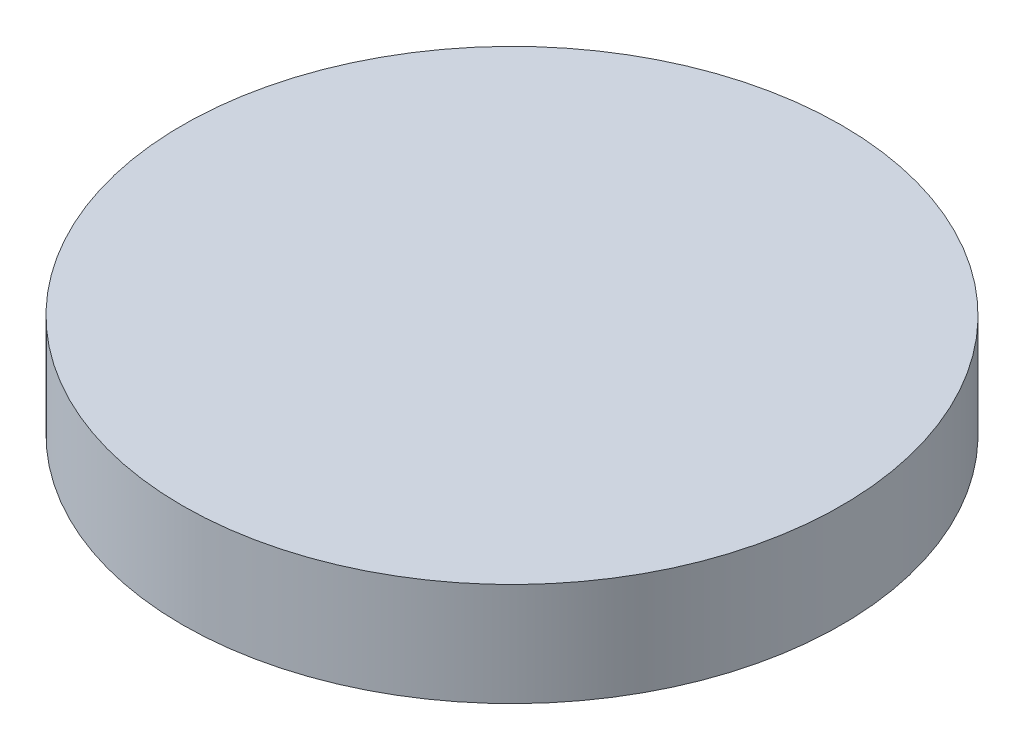
ISO-10303-21;
HEADER;
FILE_DESCRIPTION(('STEP AP214'),'2;1');
FILE_NAME('part.step','',(''),(''),'','','');
FILE_SCHEMA(('AUTOMOTIVE_DESIGN { 1 0 10303 214 1 1 1 1 }'));
ENDSEC;
DATA;
#1=APPLICATION_CONTEXT('core data for automotive mechanical design processes');
#2=APPLICATION_PROTOCOL_DEFINITION('international standard','automotive_design',2000,#1);
#3=PRODUCT_CONTEXT('',#1,'mechanical');
#4=PRODUCT('Part','Part','',(#3));
#5=PRODUCT_RELATED_PRODUCT_CATEGORY('part','',(#4));
#6=PRODUCT_DEFINITION_FORMATION('','',#4);
#7=PRODUCT_DEFINITION_CONTEXT('part definition',#1,'design');
#8=PRODUCT_DEFINITION('design','',#6,#7);
#9=PRODUCT_DEFINITION_SHAPE('','',#8);
#10=(LENGTH_UNIT() NAMED_UNIT(*) SI_UNIT(.MILLI.,.METRE.));
#11=(NAMED_UNIT(*) PLANE_ANGLE_UNIT() SI_UNIT($,.RADIAN.));
#12=(NAMED_UNIT(*) SI_UNIT($,.STERADIAN.) SOLID_ANGLE_UNIT());
#13=UNCERTAINTY_MEASURE_WITH_UNIT(LENGTH_MEASURE(1.E-05),#10,'distance_accuracy_value','');
#14=(GEOMETRIC_REPRESENTATION_CONTEXT(3) GLOBAL_UNCERTAINTY_ASSIGNED_CONTEXT((#13)) GLOBAL_UNIT_ASSIGNED_CONTEXT((#10,
#11,#12)) REPRESENTATION_CONTEXT('',''));
#15=CARTESIAN_POINT('',(0.,0.,0.));
#16=DIRECTION('',(0.,0.,1.));
#17=DIRECTION('',(1.,0.,0.));
#18=AXIS2_PLACEMENT_3D('',#15,#16,#17);
#19=CARTESIAN_POINT('',(0.,1.8,0.));
#20=DIRECTION('',(0.,-1.,0.));
#21=DIRECTION('',(0.,0.,-1.));
#22=AXIS2_PLACEMENT_3D('',#19,#20,#21);
#23=CYLINDRICAL_SURFACE('',#22,5.75);
#24=CARTESIAN_POINT('',(0.,1.8,0.));
#25=DIRECTION('',(0.,1.,0.));
#26=DIRECTION('',(0.,0.,1.));
#27=AXIS2_PLACEMENT_3D('',#24,#25,#26);
#28=CIRCLE('',#27,5.75);
#29=CARTESIAN_POINT('',(0.,1.8,5.75));
#30=VERTEX_POINT('',#29);
#31=EDGE_CURVE('E10',#30,#30,#28,.T.);
#32=ORIENTED_EDGE('',*,*,#31,.F.);
#33=EDGE_LOOP('',(#32));
#34=FACE_BOUND('',#33,.T.);
#35=CARTESIAN_POINT('',(0.,0.,0.));
#36=DIRECTION('',(0.,1.,0.));
#37=DIRECTION('',(0.,0.,1.));
#38=AXIS2_PLACEMENT_3D('',#35,#36,#37);
#39=CIRCLE('',#38,5.75);
#40=CARTESIAN_POINT('',(0.,0.,5.75));
#41=VERTEX_POINT('',#40);
#42=EDGE_CURVE('E47',#41,#41,#39,.T.);
#43=ORIENTED_EDGE('',*,*,#42,.T.);
#44=EDGE_LOOP('',(#43));
#45=FACE_BOUND('',#44,.T.);
#46=ADVANCED_FACE('F44',(#34,#45),#23,.T.);
#47=CARTESIAN_POINT('',(0.,1.8,0.));
#48=DIRECTION('',(0.,1.,0.));
#49=DIRECTION('',(0.,0.,1.));
#50=AXIS2_PLACEMENT_3D('',#47,#48,#49);
#51=PLANE('',#50);
#52=ORIENTED_EDGE('',*,*,#31,.T.);
#53=EDGE_LOOP('',(#52));
#54=FACE_BOUND('',#53,.T.);
#55=ADVANCED_FACE('F63',(#54),#51,.T.);
#56=CARTESIAN_POINT('',(0.,0.,0.));
#57=DIRECTION('',(0.,1.,0.));
#58=DIRECTION('',(0.,0.,1.));
#59=AXIS2_PLACEMENT_3D('',#56,#57,#58);
#60=PLANE('',#59);
#61=ORIENTED_EDGE('',*,*,#42,.F.);
#62=EDGE_LOOP('',(#61));
#63=FACE_BOUND('',#62,.T.);
#64=ADVANCED_FACE('F61',(#63),#60,.F.);
#65=CLOSED_SHELL('',(#46,#55,#64));
#66=MANIFOLD_SOLID_BREP('B2',#65);
#67=ADVANCED_BREP_SHAPE_REPRESENTATION('',(#18,#66),#14);
#68=SHAPE_DEFINITION_REPRESENTATION(#9,#67);
ENDSEC;
END-ISO-10303-21;
